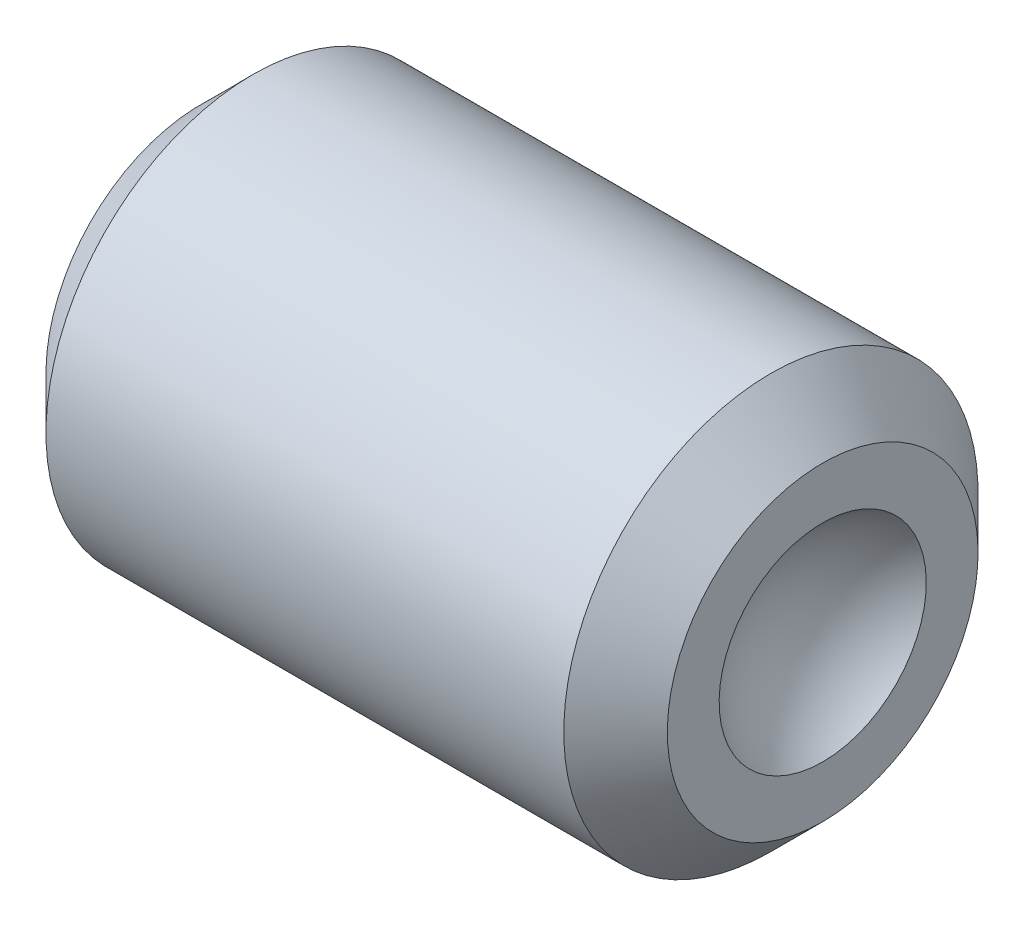
ISO-10303-21;
HEADER;
FILE_DESCRIPTION(('STEP AP214'),'2;1');
FILE_NAME('part.step','',(''),(''),'','','');
FILE_SCHEMA(('AUTOMOTIVE_DESIGN { 1 0 10303 214 1 1 1 1 }'));
ENDSEC;
DATA;
#1=APPLICATION_CONTEXT('core data for automotive mechanical design processes');
#2=APPLICATION_PROTOCOL_DEFINITION('international standard','automotive_design',2000,#1);
#3=PRODUCT_CONTEXT('',#1,'mechanical');
#4=PRODUCT('Part','Part','',(#3));
#5=PRODUCT_RELATED_PRODUCT_CATEGORY('part','',(#4));
#6=PRODUCT_DEFINITION_FORMATION('','',#4);
#7=PRODUCT_DEFINITION_CONTEXT('part definition',#1,'design');
#8=PRODUCT_DEFINITION('design','',#6,#7);
#9=PRODUCT_DEFINITION_SHAPE('','',#8);
#10=(LENGTH_UNIT() NAMED_UNIT(*) SI_UNIT(.MILLI.,.METRE.));
#11=(NAMED_UNIT(*) PLANE_ANGLE_UNIT() SI_UNIT($,.RADIAN.));
#12=(NAMED_UNIT(*) SI_UNIT($,.STERADIAN.) SOLID_ANGLE_UNIT());
#13=UNCERTAINTY_MEASURE_WITH_UNIT(LENGTH_MEASURE(1.E-05),#10,'distance_accuracy_value','');
#14=(GEOMETRIC_REPRESENTATION_CONTEXT(3) GLOBAL_UNCERTAINTY_ASSIGNED_CONTEXT((#13)) GLOBAL_UNIT_ASSIGNED_CONTEXT((#10,
#11,#12)) REPRESENTATION_CONTEXT('',''));
#15=CARTESIAN_POINT('',(0.,0.,0.));
#16=DIRECTION('',(0.,0.,1.));
#17=DIRECTION('',(1.,0.,0.));
#18=AXIS2_PLACEMENT_3D('',#15,#16,#17);
#19=CARTESIAN_POINT('',(0.,0.,0.));
#20=DIRECTION('',(1.,0.,0.));
#21=DIRECTION('',(0.,1.,0.));
#22=AXIS2_PLACEMENT_3D('',#19,#20,#21);
#23=PLANE('',#22);
#24=DIRECTION('',(0.,-0.5,-0.866025403784439));
#25=VECTOR('',#24,1.);
#26=CARTESIAN_POINT('',(0.,1.15470053837925,0.));
#27=LINE('',#26,#25);
#28=CARTESIAN_POINT('',(0.,1.15470053837925,0.));
#29=VERTEX_POINT('',#28);
#30=CARTESIAN_POINT('',(0.,0.577350269189626,-1.));
#31=VERTEX_POINT('',#30);
#32=EDGE_CURVE('E107',#29,#31,#27,.T.);
#33=ORIENTED_EDGE('',*,*,#32,.F.);
#34=DIRECTION('',(0.,0.5,-0.866025403784438));
#35=VECTOR('',#34,1.);
#36=CARTESIAN_POINT('',(0.,0.577350269189626,1.));
#37=LINE('',#36,#35);
#38=CARTESIAN_POINT('',(0.,0.577350269189626,1.));
#39=VERTEX_POINT('',#38);
#40=EDGE_CURVE('E49',#39,#29,#37,.T.);
#41=ORIENTED_EDGE('',*,*,#40,.F.);
#42=DIRECTION('',(0.,1.,0.));
#43=VECTOR('',#42,1.);
#44=CARTESIAN_POINT('',(0.,-0.577350269189626,1.));
#45=LINE('',#44,#43);
#46=CARTESIAN_POINT('',(0.,-0.577350269189626,1.));
#47=VERTEX_POINT('',#46);
#48=EDGE_CURVE('E122',#47,#39,#45,.T.);
#49=ORIENTED_EDGE('',*,*,#48,.F.);
#50=DIRECTION('',(0.,0.5,0.866025403784439));
#51=VECTOR('',#50,1.);
#52=CARTESIAN_POINT('',(0.,-1.15470053837925,0.));
#53=LINE('',#52,#51);
#54=CARTESIAN_POINT('',(0.,-1.15470053837925,0.));
#55=VERTEX_POINT('',#54);
#56=EDGE_CURVE('E116',#55,#47,#53,.T.);
#57=ORIENTED_EDGE('',*,*,#56,.F.);
#58=DIRECTION('',(0.,-0.5,0.866025403784438));
#59=VECTOR('',#58,1.);
#60=CARTESIAN_POINT('',(0.,-0.577350269189625,-1.));
#61=LINE('',#60,#59);
#62=CARTESIAN_POINT('',(0.,-0.577350269189625,-1.));
#63=VERTEX_POINT('',#62);
#64=EDGE_CURVE('E114',#63,#55,#61,.T.);
#65=ORIENTED_EDGE('',*,*,#64,.F.);
#66=DIRECTION('',(0.,-1.,0.));
#67=VECTOR('',#66,1.);
#68=CARTESIAN_POINT('',(0.,0.577350269189626,-1.));
#69=LINE('',#68,#67);
#70=EDGE_CURVE('E100',#31,#63,#69,.T.);
#71=ORIENTED_EDGE('',*,*,#70,.F.);
#72=EDGE_LOOP('',(#33,#41,#49,#57,#65,#71));
#73=FACE_BOUND('',#72,.T.);
#74=CARTESIAN_POINT('',(0.,0.,0.));
#75=DIRECTION('',(-1.,0.,0.));
#76=DIRECTION('',(0.,-1.,0.));
#77=AXIS2_PLACEMENT_3D('',#74,#75,#76);
#78=CIRCLE('',#77,1.5);
#79=CARTESIAN_POINT('',(0.,-1.5,0.));
#80=VERTEX_POINT('',#79);
#81=EDGE_CURVE('E12',#80,#80,#78,.T.);
#82=ORIENTED_EDGE('',*,*,#81,.T.);
#83=EDGE_LOOP('',(#82));
#84=FACE_BOUND('',#83,.T.);
#85=ADVANCED_FACE('F35',(#73,#84),#23,.F.);
#86=CARTESIAN_POINT('',(0.500000000000001,0.,0.));
#87=DIRECTION('',(1.,0.,0.));
#88=DIRECTION('',(0.,1.,0.));
#89=AXIS2_PLACEMENT_3D('',#86,#87,#88);
#90=CONICAL_SURFACE('',#89,2.,0.785398163397447);
#91=ORIENTED_EDGE('',*,*,#81,.F.);
#92=EDGE_LOOP('',(#91));
#93=FACE_BOUND('',#92,.T.);
#94=CARTESIAN_POINT('',(0.500000000000001,0.,0.));
#95=DIRECTION('',(-1.,0.,0.));
#96=DIRECTION('',(0.,-1.,0.));
#97=AXIS2_PLACEMENT_3D('',#94,#95,#96);
#98=CIRCLE('',#97,2.);
#99=CARTESIAN_POINT('',(0.500000000000001,-2.,0.));
#100=VERTEX_POINT('',#99);
#101=EDGE_CURVE('E42',#100,#100,#98,.T.);
#102=ORIENTED_EDGE('',*,*,#101,.T.);
#103=EDGE_LOOP('',(#102));
#104=FACE_BOUND('',#103,.T.);
#105=ADVANCED_FACE('F145',(#93,#104),#90,.T.);
#106=CARTESIAN_POINT('',(0.,0.,0.));
#107=DIRECTION('',(-1.,0.,0.));
#108=DIRECTION('',(0.,-1.,0.));
#109=AXIS2_PLACEMENT_3D('',#106,#107,#108);
#110=CYLINDRICAL_SURFACE('',#109,2.);
#111=ORIENTED_EDGE('',*,*,#101,.F.);
#112=EDGE_LOOP('',(#111));
#113=FACE_BOUND('',#112,.T.);
#114=CARTESIAN_POINT('',(5.5,0.,0.));
#115=DIRECTION('',(-1.,0.,0.));
#116=DIRECTION('',(0.,-1.,0.));
#117=AXIS2_PLACEMENT_3D('',#114,#115,#116);
#118=CIRCLE('',#117,2.);
#119=CARTESIAN_POINT('',(5.5,-2.,0.));
#120=VERTEX_POINT('',#119);
#121=EDGE_CURVE('E140',#120,#120,#118,.T.);
#122=ORIENTED_EDGE('',*,*,#121,.T.);
#123=EDGE_LOOP('',(#122));
#124=FACE_BOUND('',#123,.T.);
#125=ADVANCED_FACE('F147',(#113,#124),#110,.T.);
#126=CARTESIAN_POINT('',(6.,0.,0.));
#127=DIRECTION('',(-1.,0.,0.));
#128=DIRECTION('',(0.,-1.,0.));
#129=AXIS2_PLACEMENT_3D('',#126,#127,#128);
#130=CONICAL_SURFACE('',#129,1.5,0.785398163397449);
#131=ORIENTED_EDGE('',*,*,#121,.F.);
#132=EDGE_LOOP('',(#131));
#133=FACE_BOUND('',#132,.T.);
#134=CARTESIAN_POINT('',(6.,0.,0.));
#135=DIRECTION('',(-1.,0.,0.));
#136=DIRECTION('',(0.,-1.,0.));
#137=AXIS2_PLACEMENT_3D('',#134,#135,#136);
#138=CIRCLE('',#137,1.5);
#139=CARTESIAN_POINT('',(6.,-1.5,0.));
#140=VERTEX_POINT('',#139);
#141=EDGE_CURVE('E137',#140,#140,#138,.T.);
#142=ORIENTED_EDGE('',*,*,#141,.T.);
#143=EDGE_LOOP('',(#142));
#144=FACE_BOUND('',#143,.T.);
#145=ADVANCED_FACE('F150',(#133,#144),#130,.T.);
#146=CARTESIAN_POINT('',(6.,1.5,0.));
#147=DIRECTION('',(-1.,0.,0.));
#148=DIRECTION('',(0.,-1.,0.));
#149=AXIS2_PLACEMENT_3D('',#146,#147,#148);
#150=PLANE('',#149);
#151=ORIENTED_EDGE('',*,*,#141,.F.);
#152=EDGE_LOOP('',(#151));
#153=FACE_BOUND('',#152,.T.);
#154=CARTESIAN_POINT('',(6.,0.,0.));
#155=DIRECTION('',(-1.,0.,0.));
#156=DIRECTION('',(0.,-1.,0.));
#157=AXIS2_PLACEMENT_3D('',#154,#155,#156);
#158=CIRCLE('',#157,1.);
#159=CARTESIAN_POINT('',(6.,-1.,0.));
#160=VERTEX_POINT('',#159);
#161=EDGE_CURVE('E134',#160,#160,#158,.T.);
#162=ORIENTED_EDGE('',*,*,#161,.T.);
#163=EDGE_LOOP('',(#162));
#164=FACE_BOUND('',#163,.T.);
#165=ADVANCED_FACE('F156',(#153,#164),#150,.F.);
#166=CARTESIAN_POINT('',(6.75,0.,0.));
#167=DIRECTION('',(-1.,0.,0.));
#168=DIRECTION('',(0.,-1.,0.));
#169=AXIS2_PLACEMENT_3D('',#166,#167,#168);
#170=SPHERICAL_SURFACE('',#169,1.25);
#171=ORIENTED_EDGE('',*,*,#161,.F.);
#172=EDGE_LOOP('',(#171));
#173=FACE_BOUND('',#172,.T.);
#174=ADVANCED_FACE('F162',(#173),#170,.F.);
#175=CARTESIAN_POINT('',(9.05505046330389,0.577350269189626,1.));
#176=DIRECTION('',(0.,0.866025403784439,0.5));
#177=DIRECTION('',(0.,-0.5,0.866025403784439));
#178=AXIS2_PLACEMENT_3D('',#175,#176,#177);
#179=PLANE('',#178);
#180=DIRECTION('',(0.,-0.5,0.866025403784439));
#181=VECTOR('',#180,1.);
#182=CARTESIAN_POINT('',(4.,0.577350269189626,1.));
#183=LINE('',#182,#181);
#184=CARTESIAN_POINT('',(4.,1.15470053837925,0.));
#185=VERTEX_POINT('',#184);
#186=CARTESIAN_POINT('',(4.,0.577350269189626,1.));
#187=VERTEX_POINT('',#186);
#188=EDGE_CURVE('E68',#185,#187,#183,.T.);
#189=ORIENTED_EDGE('',*,*,#188,.T.);
#190=DIRECTION('',(-1.,0.,0.));
#191=VECTOR('',#190,1.);
#192=CARTESIAN_POINT('',(9.05505046330389,0.577350269189626,1.));
#193=LINE('',#192,#191);
#194=EDGE_CURVE('E125',#187,#39,#193,.T.);
#195=ORIENTED_EDGE('',*,*,#194,.T.);
#196=ORIENTED_EDGE('',*,*,#40,.T.);
#197=DIRECTION('',(-1.,0.,0.));
#198=VECTOR('',#197,1.);
#199=CARTESIAN_POINT('',(9.05505046330389,1.15470053837925,0.));
#200=LINE('',#199,#198);
#201=EDGE_CURVE('E104',#185,#29,#200,.T.);
#202=ORIENTED_EDGE('',*,*,#201,.F.);
#203=EDGE_LOOP('',(#189,#195,#196,#202));
#204=FACE_BOUND('',#203,.T.);
#205=ADVANCED_FACE('F167',(#204),#179,.F.);
#206=CARTESIAN_POINT('',(9.05505046330389,-0.577350269189626,1.));
#207=DIRECTION('',(0.,0.,1.));
#208=DIRECTION('',(1.,0.,0.));
#209=AXIS2_PLACEMENT_3D('',#206,#207,#208);
#210=PLANE('',#209);
#211=DIRECTION('',(0.,-1.,0.));
#212=VECTOR('',#211,1.);
#213=CARTESIAN_POINT('',(4.,-0.577350269189626,1.));
#214=LINE('',#213,#212);
#215=CARTESIAN_POINT('',(4.,-0.577350269189626,1.));
#216=VERTEX_POINT('',#215);
#217=EDGE_CURVE('E267',#187,#216,#214,.T.);
#218=ORIENTED_EDGE('',*,*,#217,.T.);
#219=DIRECTION('',(-1.,0.,0.));
#220=VECTOR('',#219,1.);
#221=CARTESIAN_POINT('',(9.05505046330389,-0.577350269189626,1.));
#222=LINE('',#221,#220);
#223=EDGE_CURVE('E127',#216,#47,#222,.T.);
#224=ORIENTED_EDGE('',*,*,#223,.T.);
#225=ORIENTED_EDGE('',*,*,#48,.T.);
#226=ORIENTED_EDGE('',*,*,#194,.F.);
#227=EDGE_LOOP('',(#218,#224,#225,#226));
#228=FACE_BOUND('',#227,.T.);
#229=ADVANCED_FACE('F172',(#228),#210,.F.);
#230=CARTESIAN_POINT('',(9.05505046330389,-1.15470053837925,0.));
#231=DIRECTION('',(0.,-0.866025403784439,0.5));
#232=DIRECTION('',(0.,-0.5,-0.866025403784439));
#233=AXIS2_PLACEMENT_3D('',#230,#231,#232);
#234=PLANE('',#233);
#235=DIRECTION('',(0.,-0.5,-0.866025403784439));
#236=VECTOR('',#235,1.);
#237=CARTESIAN_POINT('',(4.,-1.15470053837925,0.));
#238=LINE('',#237,#236);
#239=CARTESIAN_POINT('',(4.,-1.15470053837925,0.));
#240=VERTEX_POINT('',#239);
#241=EDGE_CURVE('E270',#216,#240,#238,.T.);
#242=ORIENTED_EDGE('',*,*,#241,.T.);
#243=DIRECTION('',(-1.,0.,0.));
#244=VECTOR('',#243,1.);
#245=CARTESIAN_POINT('',(9.05505046330389,-1.15470053837925,0.));
#246=LINE('',#245,#244);
#247=EDGE_CURVE('E129',#240,#55,#246,.T.);
#248=ORIENTED_EDGE('',*,*,#247,.T.);
#249=ORIENTED_EDGE('',*,*,#56,.T.);
#250=ORIENTED_EDGE('',*,*,#223,.F.);
#251=EDGE_LOOP('',(#242,#248,#249,#250));
#252=FACE_BOUND('',#251,.T.);
#253=ADVANCED_FACE('F217',(#252),#234,.F.);
#254=CARTESIAN_POINT('',(9.05505046330389,-0.577350269189626,-1.));
#255=DIRECTION('',(0.,-0.866025403784439,-0.5));
#256=DIRECTION('',(0.,0.5,-0.866025403784439));
#257=AXIS2_PLACEMENT_3D('',#254,#255,#256);
#258=PLANE('',#257);
#259=DIRECTION('',(0.,0.5,-0.866025403784439));
#260=VECTOR('',#259,1.);
#261=CARTESIAN_POINT('',(4.,-0.577350269189625,-1.));
#262=LINE('',#261,#260);
#263=CARTESIAN_POINT('',(4.,-0.577350269189626,-1.));
#264=VERTEX_POINT('',#263);
#265=EDGE_CURVE('E58',#240,#264,#262,.T.);
#266=ORIENTED_EDGE('',*,*,#265,.T.);
#267=DIRECTION('',(-1.,0.,0.));
#268=VECTOR('',#267,1.);
#269=CARTESIAN_POINT('',(9.05505046330389,-0.577350269189626,-1.));
#270=LINE('',#269,#268);
#271=EDGE_CURVE('E103',#264,#63,#270,.T.);
#272=ORIENTED_EDGE('',*,*,#271,.T.);
#273=ORIENTED_EDGE('',*,*,#64,.T.);
#274=ORIENTED_EDGE('',*,*,#247,.F.);
#275=EDGE_LOOP('',(#266,#272,#273,#274));
#276=FACE_BOUND('',#275,.T.);
#277=ADVANCED_FACE('F227',(#276),#258,.F.);
#278=CARTESIAN_POINT('',(9.05505046330389,0.577350269189626,-1.));
#279=DIRECTION('',(0.,0.,-1.));
#280=DIRECTION('',(-1.,0.,0.));
#281=AXIS2_PLACEMENT_3D('',#278,#279,#280);
#282=PLANE('',#281);
#283=DIRECTION('',(0.,1.,0.));
#284=VECTOR('',#283,1.);
#285=CARTESIAN_POINT('',(4.,0.577350269189626,-1.));
#286=LINE('',#285,#284);
#287=CARTESIAN_POINT('',(4.,0.577350269189626,-1.));
#288=VERTEX_POINT('',#287);
#289=EDGE_CURVE('E102',#264,#288,#286,.T.);
#290=ORIENTED_EDGE('',*,*,#289,.T.);
#291=DIRECTION('',(-1.,0.,0.));
#292=VECTOR('',#291,1.);
#293=CARTESIAN_POINT('',(9.05505046330389,0.577350269189626,-1.));
#294=LINE('',#293,#292);
#295=EDGE_CURVE('E95',#288,#31,#294,.T.);
#296=ORIENTED_EDGE('',*,*,#295,.T.);
#297=ORIENTED_EDGE('',*,*,#70,.T.);
#298=ORIENTED_EDGE('',*,*,#271,.F.);
#299=EDGE_LOOP('',(#290,#296,#297,#298));
#300=FACE_BOUND('',#299,.T.);
#301=ADVANCED_FACE('F97',(#300),#282,.F.);
#302=CARTESIAN_POINT('',(9.05505046330389,1.15470053837925,0.));
#303=DIRECTION('',(0.,0.866025403784439,-0.5));
#304=DIRECTION('',(0.,0.5,0.866025403784439));
#305=AXIS2_PLACEMENT_3D('',#302,#303,#304);
#306=PLANE('',#305);
#307=DIRECTION('',(0.,0.5,0.866025403784439));
#308=VECTOR('',#307,1.);
#309=CARTESIAN_POINT('',(4.,1.15470053837925,0.));
#310=LINE('',#309,#308);
#311=EDGE_CURVE('E77',#288,#185,#310,.T.);
#312=ORIENTED_EDGE('',*,*,#311,.T.);
#313=ORIENTED_EDGE('',*,*,#201,.T.);
#314=ORIENTED_EDGE('',*,*,#32,.T.);
#315=ORIENTED_EDGE('',*,*,#295,.F.);
#316=EDGE_LOOP('',(#312,#313,#314,#315));
#317=FACE_BOUND('',#316,.T.);
#318=ADVANCED_FACE('F108',(#317),#306,.F.);
#319=CARTESIAN_POINT('',(4.,1.5,0.));
#320=DIRECTION('',(-1.,0.,0.));
#321=DIRECTION('',(0.,-1.,0.));
#322=AXIS2_PLACEMENT_3D('',#319,#320,#321);
#323=PLANE('',#322);
#324=ORIENTED_EDGE('',*,*,#188,.F.);
#325=ORIENTED_EDGE('',*,*,#311,.F.);
#326=ORIENTED_EDGE('',*,*,#289,.F.);
#327=ORIENTED_EDGE('',*,*,#265,.F.);
#328=ORIENTED_EDGE('',*,*,#241,.F.);
#329=ORIENTED_EDGE('',*,*,#217,.F.);
#330=EDGE_LOOP('',(#324,#325,#326,#327,#328,#329));
#331=FACE_BOUND('',#330,.T.);
#332=ADVANCED_FACE('F253',(#331),#323,.T.);
#333=CLOSED_SHELL('',(#85,#105,#125,#145,#165,#174,#205,#229,#253,#277,#301,#318,#332));
#334=MANIFOLD_SOLID_BREP('B2',#333);
#335=ADVANCED_BREP_SHAPE_REPRESENTATION('',(#18,#334),#14);
#336=SHAPE_DEFINITION_REPRESENTATION(#9,#335);
ENDSEC;
END-ISO-10303-21;
